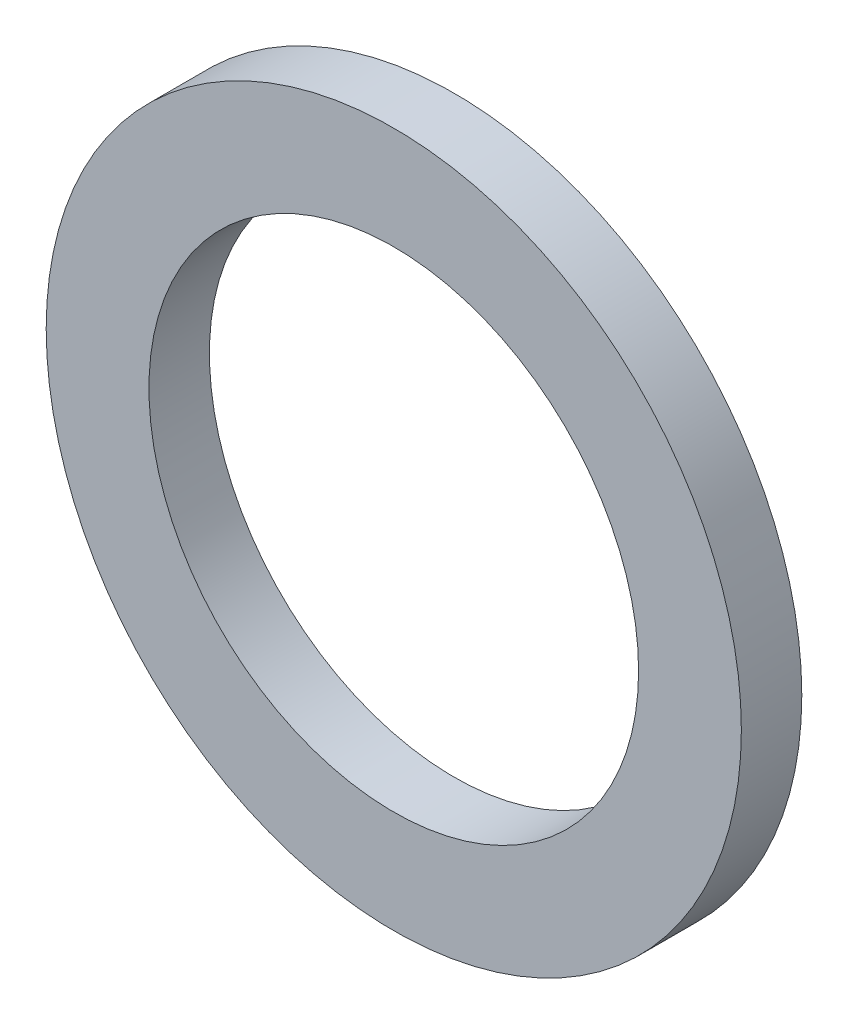
ISO-10303-21;
HEADER;
FILE_DESCRIPTION(('STEP AP214'),'2;1');
FILE_NAME('part.step','',(''),(''),'','','');
FILE_SCHEMA(('AUTOMOTIVE_DESIGN { 1 0 10303 214 1 1 1 1 }'));
ENDSEC;
DATA;
#1=APPLICATION_CONTEXT('core data for automotive mechanical design processes');
#2=APPLICATION_PROTOCOL_DEFINITION('international standard','automotive_design',2000,#1);
#3=PRODUCT_CONTEXT('',#1,'mechanical');
#4=PRODUCT('Part','Part','',(#3));
#5=PRODUCT_RELATED_PRODUCT_CATEGORY('part','',(#4));
#6=PRODUCT_DEFINITION_FORMATION('','',#4);
#7=PRODUCT_DEFINITION_CONTEXT('part definition',#1,'design');
#8=PRODUCT_DEFINITION('design','',#6,#7);
#9=PRODUCT_DEFINITION_SHAPE('','',#8);
#10=(LENGTH_UNIT() NAMED_UNIT(*) SI_UNIT(.MILLI.,.METRE.));
#11=(NAMED_UNIT(*) PLANE_ANGLE_UNIT() SI_UNIT($,.RADIAN.));
#12=(NAMED_UNIT(*) SI_UNIT($,.STERADIAN.) SOLID_ANGLE_UNIT());
#13=UNCERTAINTY_MEASURE_WITH_UNIT(LENGTH_MEASURE(1.E-05),#10,'distance_accuracy_value','');
#14=(GEOMETRIC_REPRESENTATION_CONTEXT(3) GLOBAL_UNCERTAINTY_ASSIGNED_CONTEXT((#13)) GLOBAL_UNIT_ASSIGNED_CONTEXT((#10,
#11,#12)) REPRESENTATION_CONTEXT('',''));
#15=CARTESIAN_POINT('',(0.,0.,0.));
#16=DIRECTION('',(0.,0.,1.));
#17=DIRECTION('',(1.,0.,0.));
#18=AXIS2_PLACEMENT_3D('',#15,#16,#17);
#19=CARTESIAN_POINT('',(0.,0.,1.));
#20=DIRECTION('',(0.,0.,1.));
#21=DIRECTION('',(1.,0.,0.));
#22=AXIS2_PLACEMENT_3D('',#19,#20,#21);
#23=PLANE('',#22);
#24=CARTESIAN_POINT('',(0.,0.,1.));
#25=DIRECTION('',(0.,0.,1.));
#26=DIRECTION('',(1.,0.,0.));
#27=AXIS2_PLACEMENT_3D('',#24,#25,#26);
#28=CIRCLE('',#27,5.75);
#29=CARTESIAN_POINT('',(5.75,0.,1.));
#30=VERTEX_POINT('',#29);
#31=EDGE_CURVE('E10',#30,#30,#28,.T.);
#32=ORIENTED_EDGE('',*,*,#31,.T.);
#33=EDGE_LOOP('',(#32));
#34=FACE_BOUND('',#33,.T.);
#35=CARTESIAN_POINT('',(0.,0.,1.));
#36=DIRECTION('',(0.,0.,1.));
#37=DIRECTION('',(1.,0.,0.));
#38=AXIS2_PLACEMENT_3D('',#35,#36,#37);
#39=CIRCLE('',#38,4.05);
#40=CARTESIAN_POINT('',(4.05,0.,1.));
#41=VERTEX_POINT('',#40);
#42=EDGE_CURVE('E50',#41,#41,#39,.T.);
#43=ORIENTED_EDGE('',*,*,#42,.F.);
#44=EDGE_LOOP('',(#43));
#45=FACE_BOUND('',#44,.T.);
#46=ADVANCED_FACE('F37',(#34,#45),#23,.T.);
#47=CARTESIAN_POINT('',(0.,0.,0.));
#48=DIRECTION('',(0.,0.,1.));
#49=DIRECTION('',(1.,0.,0.));
#50=AXIS2_PLACEMENT_3D('',#47,#48,#49);
#51=PLANE('',#50);
#52=CARTESIAN_POINT('',(0.,0.,0.));
#53=DIRECTION('',(0.,0.,1.));
#54=DIRECTION('',(1.,0.,0.));
#55=AXIS2_PLACEMENT_3D('',#52,#53,#54);
#56=CIRCLE('',#55,5.75);
#57=CARTESIAN_POINT('',(5.75,0.,0.));
#58=VERTEX_POINT('',#57);
#59=EDGE_CURVE('E41',#58,#58,#56,.T.);
#60=ORIENTED_EDGE('',*,*,#59,.F.);
#61=EDGE_LOOP('',(#60));
#62=FACE_BOUND('',#61,.T.);
#63=CARTESIAN_POINT('',(0.,0.,0.));
#64=DIRECTION('',(0.,0.,1.));
#65=DIRECTION('',(1.,0.,0.));
#66=AXIS2_PLACEMENT_3D('',#63,#64,#65);
#67=CIRCLE('',#66,4.05);
#68=CARTESIAN_POINT('',(4.05,0.,0.));
#69=VERTEX_POINT('',#68);
#70=EDGE_CURVE('E52',#69,#69,#67,.T.);
#71=ORIENTED_EDGE('',*,*,#70,.T.);
#72=EDGE_LOOP('',(#71));
#73=FACE_BOUND('',#72,.T.);
#74=ADVANCED_FACE('F64',(#62,#73),#51,.F.);
#75=CARTESIAN_POINT('',(0.,0.,1.));
#76=DIRECTION('',(0.,0.,-1.));
#77=DIRECTION('',(-1.,0.,0.));
#78=AXIS2_PLACEMENT_3D('',#75,#76,#77);
#79=CYLINDRICAL_SURFACE('',#78,5.75);
#80=ORIENTED_EDGE('',*,*,#31,.F.);
#81=EDGE_LOOP('',(#80));
#82=FACE_BOUND('',#81,.T.);
#83=ORIENTED_EDGE('',*,*,#59,.T.);
#84=EDGE_LOOP('',(#83));
#85=FACE_BOUND('',#84,.T.);
#86=ADVANCED_FACE('F39',(#82,#85),#79,.T.);
#87=CARTESIAN_POINT('',(0.,0.,1.));
#88=DIRECTION('',(0.,0.,-1.));
#89=DIRECTION('',(-1.,0.,0.));
#90=AXIS2_PLACEMENT_3D('',#87,#88,#89);
#91=CYLINDRICAL_SURFACE('',#90,4.05);
#92=ORIENTED_EDGE('',*,*,#42,.T.);
#93=EDGE_LOOP('',(#92));
#94=FACE_BOUND('',#93,.T.);
#95=ORIENTED_EDGE('',*,*,#70,.F.);
#96=EDGE_LOOP('',(#95));
#97=FACE_BOUND('',#96,.T.);
#98=ADVANCED_FACE('F60',(#94,#97),#91,.F.);
#99=CLOSED_SHELL('',(#46,#74,#86,#98));
#100=MANIFOLD_SOLID_BREP('B2',#99);
#101=ADVANCED_BREP_SHAPE_REPRESENTATION('',(#18,#100),#14);
#102=SHAPE_DEFINITION_REPRESENTATION(#9,#101);
ENDSEC;
END-ISO-10303-21;
